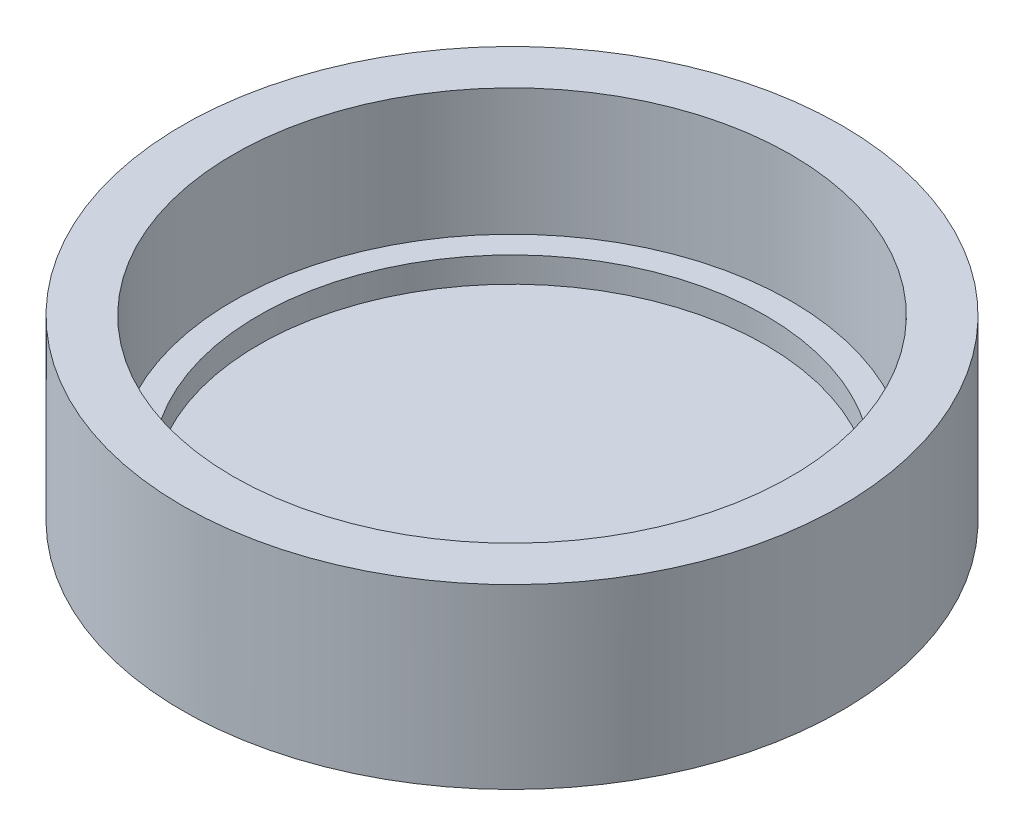
ISO-10303-21;
HEADER;
FILE_DESCRIPTION(('STEP AP214'),'2;1');
FILE_NAME('part.step','',(''),(''),'','','');
FILE_SCHEMA(('AUTOMOTIVE_DESIGN { 1 0 10303 214 1 1 1 1 }'));
ENDSEC;
DATA;
#1=APPLICATION_CONTEXT('core data for automotive mechanical design processes');
#2=APPLICATION_PROTOCOL_DEFINITION('international standard','automotive_design',2000,#1);
#3=PRODUCT_CONTEXT('',#1,'mechanical');
#4=PRODUCT('Part','Part','',(#3));
#5=PRODUCT_RELATED_PRODUCT_CATEGORY('part','',(#4));
#6=PRODUCT_DEFINITION_FORMATION('','',#4);
#7=PRODUCT_DEFINITION_CONTEXT('part definition',#1,'design');
#8=PRODUCT_DEFINITION('design','',#6,#7);
#9=PRODUCT_DEFINITION_SHAPE('','',#8);
#10=(LENGTH_UNIT() NAMED_UNIT(*) SI_UNIT(.MILLI.,.METRE.));
#11=(NAMED_UNIT(*) PLANE_ANGLE_UNIT() SI_UNIT($,.RADIAN.));
#12=(NAMED_UNIT(*) SI_UNIT($,.STERADIAN.) SOLID_ANGLE_UNIT());
#13=UNCERTAINTY_MEASURE_WITH_UNIT(LENGTH_MEASURE(1.E-05),#10,'distance_accuracy_value','');
#14=(GEOMETRIC_REPRESENTATION_CONTEXT(3) GLOBAL_UNCERTAINTY_ASSIGNED_CONTEXT((#13)) GLOBAL_UNIT_ASSIGNED_CONTEXT((#10,
#11,#12)) REPRESENTATION_CONTEXT('',''));
#15=CARTESIAN_POINT('',(0.,0.,0.));
#16=DIRECTION('',(0.,0.,1.));
#17=DIRECTION('',(1.,0.,0.));
#18=AXIS2_PLACEMENT_3D('',#15,#16,#17);
#19=CARTESIAN_POINT('',(0.,6.,0.));
#20=DIRECTION('',(0.,1.,0.));
#21=DIRECTION('',(0.,0.,1.));
#22=AXIS2_PLACEMENT_3D('',#19,#20,#21);
#23=PLANE('',#22);
#24=CARTESIAN_POINT('',(0.,6.,0.));
#25=DIRECTION('',(0.,1.,0.));
#26=DIRECTION('',(0.,0.,1.));
#27=AXIS2_PLACEMENT_3D('',#24,#25,#26);
#28=CIRCLE('',#27,13.);
#29=CARTESIAN_POINT('',(0.,6.,13.));
#30=VERTEX_POINT('',#29);
#31=EDGE_CURVE('E42',#30,#30,#28,.T.);
#32=ORIENTED_EDGE('',*,*,#31,.T.);
#33=EDGE_LOOP('',(#32));
#34=FACE_BOUND('',#33,.T.);
#35=CARTESIAN_POINT('',(0.,6.,0.));
#36=DIRECTION('',(0.,1.,0.));
#37=DIRECTION('',(0.,0.,1.));
#38=AXIS2_PLACEMENT_3D('',#35,#36,#37);
#39=CIRCLE('',#38,11.);
#40=CARTESIAN_POINT('',(0.,6.,11.));
#41=VERTEX_POINT('',#40);
#42=EDGE_CURVE('E46',#41,#41,#39,.T.);
#43=ORIENTED_EDGE('',*,*,#42,.F.);
#44=EDGE_LOOP('',(#43));
#45=FACE_BOUND('',#44,.T.);
#46=ADVANCED_FACE('F35',(#34,#45),#23,.T.);
#47=CARTESIAN_POINT('',(0.,6.,0.));
#48=DIRECTION('',(0.,-1.,0.));
#49=DIRECTION('',(0.,0.,-1.));
#50=AXIS2_PLACEMENT_3D('',#47,#48,#49);
#51=CYLINDRICAL_SURFACE('',#50,13.);
#52=ORIENTED_EDGE('',*,*,#31,.F.);
#53=EDGE_LOOP('',(#52));
#54=FACE_BOUND('',#53,.T.);
#55=CARTESIAN_POINT('',(0.,-1.,0.));
#56=DIRECTION('',(0.,-1.,0.));
#57=DIRECTION('',(0.,0.,-1.));
#58=AXIS2_PLACEMENT_3D('',#55,#56,#57);
#59=CIRCLE('',#58,13.);
#60=CARTESIAN_POINT('',(0.,-1.,-13.));
#61=VERTEX_POINT('',#60);
#62=EDGE_CURVE('E50',#61,#61,#59,.T.);
#63=ORIENTED_EDGE('',*,*,#62,.F.);
#64=EDGE_LOOP('',(#63));
#65=FACE_BOUND('',#64,.T.);
#66=ADVANCED_FACE('F37',(#54,#65),#51,.T.);
#67=CARTESIAN_POINT('',(0.,6.,0.));
#68=DIRECTION('',(0.,-1.,0.));
#69=DIRECTION('',(0.,0.,-1.));
#70=AXIS2_PLACEMENT_3D('',#67,#68,#69);
#71=CYLINDRICAL_SURFACE('',#70,11.);
#72=CARTESIAN_POINT('',(0.,1.,0.));
#73=DIRECTION('',(0.,1.,0.));
#74=DIRECTION('',(0.,0.,1.));
#75=AXIS2_PLACEMENT_3D('',#72,#73,#74);
#76=CIRCLE('',#75,11.);
#77=CARTESIAN_POINT('',(0.,1.,11.));
#78=VERTEX_POINT('',#77);
#79=EDGE_CURVE('E10',#78,#78,#76,.T.);
#80=ORIENTED_EDGE('',*,*,#79,.F.);
#81=EDGE_LOOP('',(#80));
#82=FACE_BOUND('',#81,.T.);
#83=ORIENTED_EDGE('',*,*,#42,.T.);
#84=EDGE_LOOP('',(#83));
#85=FACE_BOUND('',#84,.T.);
#86=ADVANCED_FACE('F75',(#82,#85),#71,.F.);
#87=CARTESIAN_POINT('',(0.,-1.,0.));
#88=DIRECTION('',(0.,-1.,0.));
#89=DIRECTION('',(0.,0.,-1.));
#90=AXIS2_PLACEMENT_3D('',#87,#88,#89);
#91=PLANE('',#90);
#92=ORIENTED_EDGE('',*,*,#62,.T.);
#93=EDGE_LOOP('',(#92));
#94=FACE_BOUND('',#93,.T.);
#95=ADVANCED_FACE('F67',(#94),#91,.T.);
#96=CARTESIAN_POINT('',(0.,1.,0.));
#97=DIRECTION('',(0.,1.,0.));
#98=DIRECTION('',(0.,0.,1.));
#99=AXIS2_PLACEMENT_3D('',#96,#97,#98);
#100=PLANE('',#99);
#101=ORIENTED_EDGE('',*,*,#79,.T.);
#102=EDGE_LOOP('',(#101));
#103=FACE_BOUND('',#102,.T.);
#104=CARTESIAN_POINT('',(0.,1.,0.));
#105=DIRECTION('',(0.,1.,0.));
#106=DIRECTION('',(0.,0.,1.));
#107=AXIS2_PLACEMENT_3D('',#104,#105,#106);
#108=CIRCLE('',#107,10.);
#109=CARTESIAN_POINT('',(0.,1.,10.));
#110=VERTEX_POINT('',#109);
#111=EDGE_CURVE('E55',#110,#110,#108,.T.);
#112=ORIENTED_EDGE('',*,*,#111,.F.);
#113=EDGE_LOOP('',(#112));
#114=FACE_BOUND('',#113,.T.);
#115=ADVANCED_FACE('F65',(#103,#114),#100,.T.);
#116=CARTESIAN_POINT('',(0.,1.,0.));
#117=DIRECTION('',(0.,-1.,0.));
#118=DIRECTION('',(0.,0.,-1.));
#119=AXIS2_PLACEMENT_3D('',#116,#117,#118);
#120=CYLINDRICAL_SURFACE('',#119,10.);
#121=ORIENTED_EDGE('',*,*,#111,.T.);
#122=EDGE_LOOP('',(#121));
#123=FACE_BOUND('',#122,.T.);
#124=CARTESIAN_POINT('',(0.,0.,0.));
#125=DIRECTION('',(0.,1.,0.));
#126=DIRECTION('',(0.,0.,1.));
#127=AXIS2_PLACEMENT_3D('',#124,#125,#126);
#128=CIRCLE('',#127,10.);
#129=CARTESIAN_POINT('',(0.,0.,10.));
#130=VERTEX_POINT('',#129);
#131=EDGE_CURVE('E56',#130,#130,#128,.T.);
#132=ORIENTED_EDGE('',*,*,#131,.F.);
#133=EDGE_LOOP('',(#132));
#134=FACE_BOUND('',#133,.T.);
#135=ADVANCED_FACE('F62',(#123,#134),#120,.F.);
#136=CARTESIAN_POINT('',(0.,0.,0.));
#137=DIRECTION('',(0.,-1.,0.));
#138=DIRECTION('',(0.,0.,-1.));
#139=AXIS2_PLACEMENT_3D('',#136,#137,#138);
#140=PLANE('',#139);
#141=ORIENTED_EDGE('',*,*,#131,.T.);
#142=EDGE_LOOP('',(#141));
#143=FACE_BOUND('',#142,.T.);
#144=ADVANCED_FACE('F73',(#143),#140,.F.);
#145=CLOSED_SHELL('',(#46,#66,#86,#95,#115,#135,#144));
#146=MANIFOLD_SOLID_BREP('B2',#145);
#147=ADVANCED_BREP_SHAPE_REPRESENTATION('',(#18,#146),#14);
#148=SHAPE_DEFINITION_REPRESENTATION(#9,#147);
ENDSEC;
END-ISO-10303-21;
